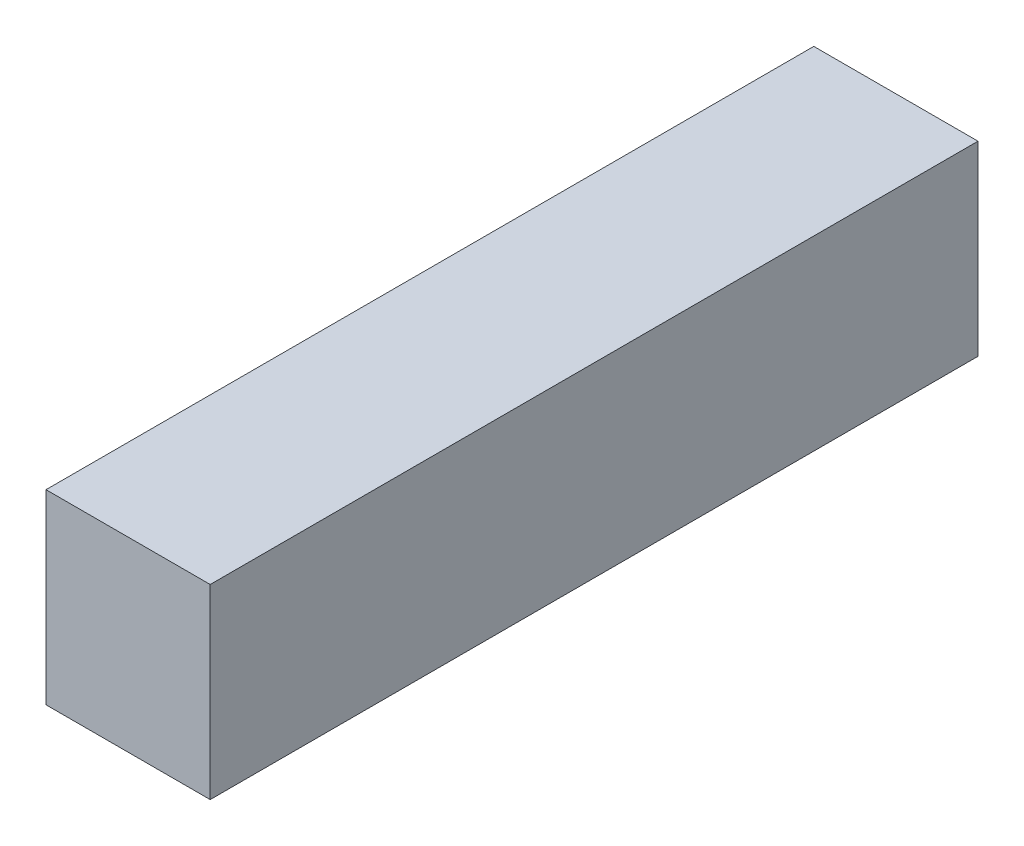
ISO-10303-21;
HEADER;
FILE_DESCRIPTION(('STEP AP214'),'2;1');
FILE_NAME('part.step','',(''),(''),'','','');
FILE_SCHEMA(('AUTOMOTIVE_DESIGN { 1 0 10303 214 1 1 1 1 }'));
ENDSEC;
DATA;
#1=APPLICATION_CONTEXT('core data for automotive mechanical design processes');
#2=APPLICATION_PROTOCOL_DEFINITION('international standard','automotive_design',2000,#1);
#3=PRODUCT_CONTEXT('',#1,'mechanical');
#4=PRODUCT('Part','Part','',(#3));
#5=PRODUCT_RELATED_PRODUCT_CATEGORY('part','',(#4));
#6=PRODUCT_DEFINITION_FORMATION('','',#4);
#7=PRODUCT_DEFINITION_CONTEXT('part definition',#1,'design');
#8=PRODUCT_DEFINITION('design','',#6,#7);
#9=PRODUCT_DEFINITION_SHAPE('','',#8);
#10=(LENGTH_UNIT() NAMED_UNIT(*) SI_UNIT(.MILLI.,.METRE.));
#11=(NAMED_UNIT(*) PLANE_ANGLE_UNIT() SI_UNIT($,.RADIAN.));
#12=(NAMED_UNIT(*) SI_UNIT($,.STERADIAN.) SOLID_ANGLE_UNIT());
#13=UNCERTAINTY_MEASURE_WITH_UNIT(LENGTH_MEASURE(1.E-05),#10,'distance_accuracy_value','');
#14=(GEOMETRIC_REPRESENTATION_CONTEXT(3) GLOBAL_UNCERTAINTY_ASSIGNED_CONTEXT((#13)) GLOBAL_UNIT_ASSIGNED_CONTEXT((#10,
#11,#12)) REPRESENTATION_CONTEXT('',''));
#15=CARTESIAN_POINT('',(0.,0.,0.));
#16=DIRECTION('',(0.,0.,1.));
#17=DIRECTION('',(1.,0.,0.));
#18=AXIS2_PLACEMENT_3D('',#15,#16,#17);
#19=CARTESIAN_POINT('',(76.2,101.6,-431.8));
#20=DIRECTION('',(1.,0.,0.));
#21=DIRECTION('',(0.,0.,-1.));
#22=AXIS2_PLACEMENT_3D('',#19,#20,#21);
#23=PLANE('',#22);
#24=DIRECTION('',(0.,0.,1.));
#25=VECTOR('',#24,1.);
#26=CARTESIAN_POINT('',(76.2,0.,-431.8));
#27=LINE('',#26,#25);
#28=CARTESIAN_POINT('',(76.2,0.,-431.8));
#29=VERTEX_POINT('',#28);
#30=CARTESIAN_POINT('',(76.2,0.,-13.1028531439631));
#31=VERTEX_POINT('',#30);
#32=EDGE_CURVE('E120',#29,#31,#27,.T.);
#33=ORIENTED_EDGE('',*,*,#32,.F.);
#34=DIRECTION('',(0.,-1.,0.));
#35=VECTOR('',#34,1.);
#36=CARTESIAN_POINT('',(76.2,101.6,-431.8));
#37=LINE('',#36,#35);
#38=CARTESIAN_POINT('',(76.2,101.6,-431.8));
#39=VERTEX_POINT('',#38);
#40=EDGE_CURVE('E11',#39,#29,#37,.T.);
#41=ORIENTED_EDGE('',*,*,#40,.F.);
#42=DIRECTION('',(0.,0.,1.));
#43=VECTOR('',#42,1.);
#44=CARTESIAN_POINT('',(76.2,101.6,-431.8));
#45=LINE('',#44,#43);
#46=CARTESIAN_POINT('',(76.2,101.6,-13.1028531439631));
#47=VERTEX_POINT('',#46);
#48=EDGE_CURVE('E113',#39,#47,#45,.T.);
#49=ORIENTED_EDGE('',*,*,#48,.T.);
#50=DIRECTION('',(0.,-1.,0.));
#51=VECTOR('',#50,1.);
#52=CARTESIAN_POINT('',(76.2,101.6,-13.1028531439631));
#53=LINE('',#52,#51);
#54=EDGE_CURVE('E52',#47,#31,#53,.T.);
#55=ORIENTED_EDGE('',*,*,#54,.T.);
#56=EDGE_LOOP('',(#33,#41,#49,#55));
#57=FACE_BOUND('',#56,.T.);
#58=ADVANCED_FACE('F49',(#57),#23,.T.);
#59=CARTESIAN_POINT('',(76.2,101.6,-431.8));
#60=DIRECTION('',(0.,0.,1.));
#61=DIRECTION('',(1.,0.,0.));
#62=AXIS2_PLACEMENT_3D('',#59,#60,#61);
#63=PLANE('',#62);
#64=DIRECTION('',(-1.,0.,0.));
#65=VECTOR('',#64,1.);
#66=CARTESIAN_POINT('',(76.2,0.,-431.8));
#67=LINE('',#66,#65);
#68=CARTESIAN_POINT('',(-13.3410868374897,0.,-431.8));
#69=VERTEX_POINT('',#68);
#70=EDGE_CURVE('E83',#29,#69,#67,.T.);
#71=ORIENTED_EDGE('',*,*,#70,.T.);
#72=DIRECTION('',(0.,-1.,0.));
#73=VECTOR('',#72,1.);
#74=CARTESIAN_POINT('',(-13.3410868374897,101.6,-431.8));
#75=LINE('',#74,#73);
#76=CARTESIAN_POINT('',(-13.3410868374897,101.6,-431.8));
#77=VERTEX_POINT('',#76);
#78=EDGE_CURVE('E59',#77,#69,#75,.T.);
#79=ORIENTED_EDGE('',*,*,#78,.F.);
#80=DIRECTION('',(-1.,0.,0.));
#81=VECTOR('',#80,1.);
#82=CARTESIAN_POINT('',(76.2,101.6,-431.8));
#83=LINE('',#82,#81);
#84=EDGE_CURVE('E100',#39,#77,#83,.T.);
#85=ORIENTED_EDGE('',*,*,#84,.F.);
#86=ORIENTED_EDGE('',*,*,#40,.T.);
#87=EDGE_LOOP('',(#71,#79,#85,#86));
#88=FACE_BOUND('',#87,.T.);
#89=ADVANCED_FACE('F136',(#88),#63,.F.);
#90=CARTESIAN_POINT('',(-13.3410868374897,101.6,-431.8));
#91=DIRECTION('',(1.,0.,0.));
#92=DIRECTION('',(0.,0.,-1.));
#93=AXIS2_PLACEMENT_3D('',#90,#91,#92);
#94=PLANE('',#93);
#95=DIRECTION('',(0.,0.,1.));
#96=VECTOR('',#95,1.);
#97=CARTESIAN_POINT('',(-13.3410868374897,0.,-431.8));
#98=LINE('',#97,#96);
#99=CARTESIAN_POINT('',(-13.3410868374897,0.,-13.1028531439631));
#100=VERTEX_POINT('',#99);
#101=EDGE_CURVE('E108',#69,#100,#98,.T.);
#102=ORIENTED_EDGE('',*,*,#101,.T.);
#103=DIRECTION('',(0.,-1.,0.));
#104=VECTOR('',#103,1.);
#105=CARTESIAN_POINT('',(-13.3410868374897,101.6,-13.1028531439631));
#106=LINE('',#105,#104);
#107=CARTESIAN_POINT('',(-13.3410868374897,101.6,-13.1028531439631));
#108=VERTEX_POINT('',#107);
#109=EDGE_CURVE('E105',#108,#100,#106,.T.);
#110=ORIENTED_EDGE('',*,*,#109,.F.);
#111=DIRECTION('',(0.,0.,1.));
#112=VECTOR('',#111,1.);
#113=CARTESIAN_POINT('',(-13.3410868374897,101.6,-431.8));
#114=LINE('',#113,#112);
#115=EDGE_CURVE('E95',#77,#108,#114,.T.);
#116=ORIENTED_EDGE('',*,*,#115,.F.);
#117=ORIENTED_EDGE('',*,*,#78,.T.);
#118=EDGE_LOOP('',(#102,#110,#116,#117));
#119=FACE_BOUND('',#118,.T.);
#120=ADVANCED_FACE('F106',(#119),#94,.F.);
#121=CARTESIAN_POINT('',(76.2,101.6,-13.1028531439631));
#122=DIRECTION('',(0.,0.,1.));
#123=DIRECTION('',(1.,0.,0.));
#124=AXIS2_PLACEMENT_3D('',#121,#122,#123);
#125=PLANE('',#124);
#126=DIRECTION('',(-1.,0.,0.));
#127=VECTOR('',#126,1.);
#128=CARTESIAN_POINT('',(76.2,0.,-13.1028531439631));
#129=LINE('',#128,#127);
#130=EDGE_CURVE('E124',#31,#100,#129,.T.);
#131=ORIENTED_EDGE('',*,*,#130,.F.);
#132=ORIENTED_EDGE('',*,*,#54,.F.);
#133=DIRECTION('',(-1.,0.,0.));
#134=VECTOR('',#133,1.);
#135=CARTESIAN_POINT('',(76.2,101.6,-13.1028531439631));
#136=LINE('',#135,#134);
#137=EDGE_CURVE('E99',#47,#108,#136,.T.);
#138=ORIENTED_EDGE('',*,*,#137,.T.);
#139=ORIENTED_EDGE('',*,*,#109,.T.);
#140=EDGE_LOOP('',(#131,#132,#138,#139));
#141=FACE_BOUND('',#140,.T.);
#142=ADVANCED_FACE('F111',(#141),#125,.T.);
#143=CARTESIAN_POINT('',(0.,101.6,0.));
#144=DIRECTION('',(0.,-1.,0.));
#145=DIRECTION('',(0.,0.,-1.));
#146=AXIS2_PLACEMENT_3D('',#143,#144,#145);
#147=PLANE('',#146);
#148=ORIENTED_EDGE('',*,*,#48,.F.);
#149=ORIENTED_EDGE('',*,*,#84,.T.);
#150=ORIENTED_EDGE('',*,*,#115,.T.);
#151=ORIENTED_EDGE('',*,*,#137,.F.);
#152=EDGE_LOOP('',(#148,#149,#150,#151));
#153=FACE_BOUND('',#152,.T.);
#154=ADVANCED_FACE('F98',(#153),#147,.F.);
#155=CARTESIAN_POINT('',(0.,0.,0.));
#156=DIRECTION('',(0.,-1.,0.));
#157=DIRECTION('',(0.,0.,-1.));
#158=AXIS2_PLACEMENT_3D('',#155,#156,#157);
#159=PLANE('',#158);
#160=ORIENTED_EDGE('',*,*,#32,.T.);
#161=ORIENTED_EDGE('',*,*,#130,.T.);
#162=ORIENTED_EDGE('',*,*,#101,.F.);
#163=ORIENTED_EDGE('',*,*,#70,.F.);
#164=EDGE_LOOP('',(#160,#161,#162,#163));
#165=FACE_BOUND('',#164,.T.);
#166=ADVANCED_FACE('F133',(#165),#159,.T.);
#167=CLOSED_SHELL('',(#58,#89,#120,#142,#154,#166));
#168=MANIFOLD_SOLID_BREP('B2',#167);
#169=ADVANCED_BREP_SHAPE_REPRESENTATION('',(#18,#168),#14);
#170=SHAPE_DEFINITION_REPRESENTATION(#9,#169);
ENDSEC;
END-ISO-10303-21;
